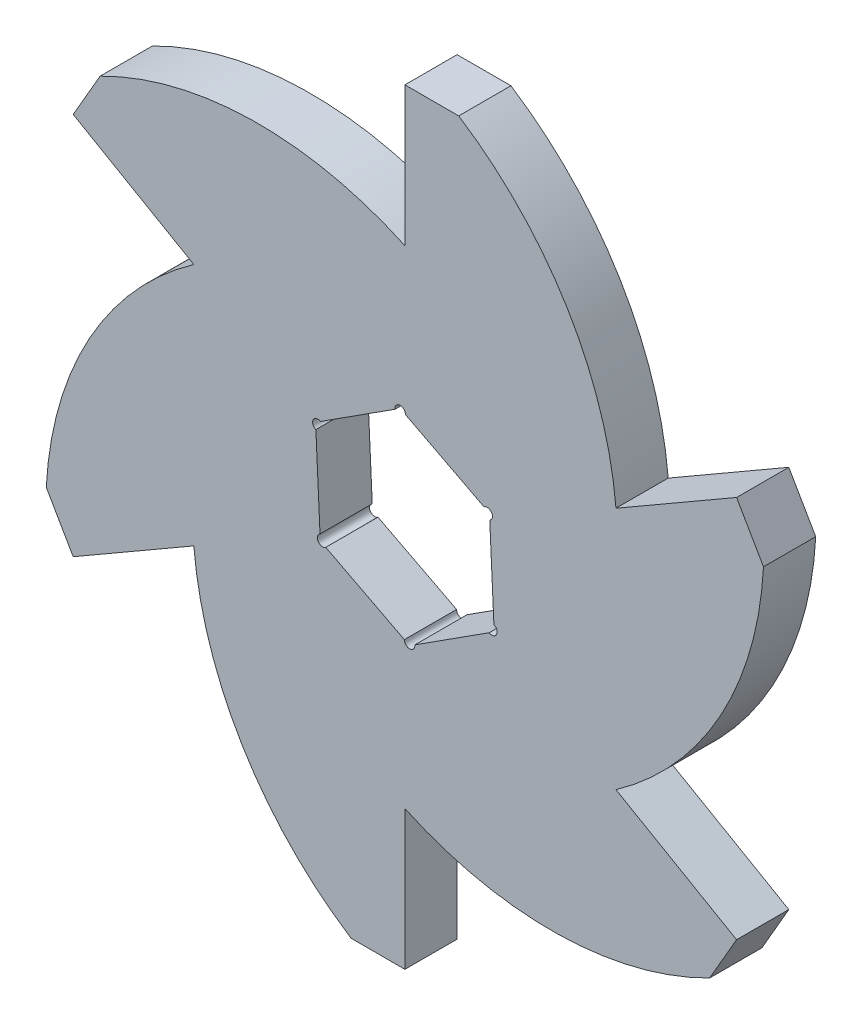
ISO-10303-21;
HEADER;
FILE_DESCRIPTION(('STEP AP214'),'2;1');
FILE_NAME('part.step','',(''),(''),'','','');
FILE_SCHEMA(('AUTOMOTIVE_DESIGN { 1 0 10303 214 1 1 1 1 }'));
ENDSEC;
DATA;
#1=APPLICATION_CONTEXT('core data for automotive mechanical design processes');
#2=APPLICATION_PROTOCOL_DEFINITION('international standard','automotive_design',2000,#1);
#3=PRODUCT_CONTEXT('',#1,'mechanical');
#4=PRODUCT('Part','Part','',(#3));
#5=PRODUCT_RELATED_PRODUCT_CATEGORY('part','',(#4));
#6=PRODUCT_DEFINITION_FORMATION('','',#4);
#7=PRODUCT_DEFINITION_CONTEXT('part definition',#1,'design');
#8=PRODUCT_DEFINITION('design','',#6,#7);
#9=PRODUCT_DEFINITION_SHAPE('','',#8);
#10=(LENGTH_UNIT() NAMED_UNIT(*) SI_UNIT(.MILLI.,.METRE.));
#11=(NAMED_UNIT(*) PLANE_ANGLE_UNIT() SI_UNIT($,.RADIAN.));
#12=(NAMED_UNIT(*) SI_UNIT($,.STERADIAN.) SOLID_ANGLE_UNIT());
#13=UNCERTAINTY_MEASURE_WITH_UNIT(LENGTH_MEASURE(1.E-05),#10,'distance_accuracy_value','');
#14=(GEOMETRIC_REPRESENTATION_CONTEXT(3) GLOBAL_UNCERTAINTY_ASSIGNED_CONTEXT((#13)) GLOBAL_UNIT_ASSIGNED_CONTEXT((#10,
#11,#12)) REPRESENTATION_CONTEXT('',''));
#15=CARTESIAN_POINT('',(0.,0.,0.));
#16=DIRECTION('',(0.,0.,1.));
#17=DIRECTION('',(1.,0.,0.));
#18=AXIS2_PLACEMENT_3D('',#15,#16,#17);
#19=CARTESIAN_POINT('',(-42.111348754247,-20.7007955097314,15.));
#20=DIRECTION('',(0.,0.,-1.));
#21=DIRECTION('',(-1.,0.,0.));
#22=AXIS2_PLACEMENT_3D('',#19,#20,#21);
#23=PLANE('',#22);
#24=CARTESIAN_POINT('',(-42.111348754247,-20.7007955097314,15.));
#25=DIRECTION('',(0.,0.,1.));
#26=DIRECTION('',(-1.,0.,0.));
#27=AXIS2_PLACEMENT_3D('',#24,#25,#26);
#28=CIRCLE('',#27,99.9999999999998);
#29=CARTESIAN_POINT('',(0.,70.,15.));
#30=VERTEX_POINT('',#29);
#31=CARTESIAN_POINT('',(-87.5330485076559,68.3883126433485,15.));
#32=VERTEX_POINT('',#31);
#33=EDGE_CURVE('E333',#30,#32,#28,.T.);
#34=ORIENTED_EDGE('',*,*,#33,.T.);
#35=DIRECTION('',(-0.500000000000011,-0.866025403784432,0.));
#36=VECTOR('',#35,1.);
#37=CARTESIAN_POINT('',(-95.2627944162876,55.0000000000011,15.));
#38=LINE('',#37,#36);
#39=CARTESIAN_POINT('',(-95.2627944162876,55.0000000000011,15.));
#40=VERTEX_POINT('',#39);
#41=EDGE_CURVE('E336',#32,#40,#38,.T.);
#42=ORIENTED_EDGE('',*,*,#41,.T.);
#43=DIRECTION('',(0.866025403784433,-0.50000000000001,0.));
#44=VECTOR('',#43,1.);
#45=CARTESIAN_POINT('',(-60.6217782649103,35.0000000000007,15.));
#46=LINE('',#45,#44);
#47=CARTESIAN_POINT('',(-60.6217782649103,35.0000000000007,15.));
#48=VERTEX_POINT('',#47);
#49=EDGE_CURVE('E339',#40,#48,#46,.T.);
#50=ORIENTED_EDGE('',*,*,#49,.T.);
#51=CARTESIAN_POINT('',(-3.12825958714913,-46.8198955636698,15.));
#52=DIRECTION('',(0.,0.,1.));
#53=DIRECTION('',(-1.,0.,0.));
#54=AXIS2_PLACEMENT_3D('',#51,#52,#53);
#55=CIRCLE('',#54,100.);
#56=CARTESIAN_POINT('',(-102.99254032492,-41.6116873566515,15.));
#57=VERTEX_POINT('',#56);
#58=EDGE_CURVE('E341',#48,#57,#55,.T.);
#59=ORIENTED_EDGE('',*,*,#58,.T.);
#60=DIRECTION('',(0.499999999999992,-0.866025403784443,0.));
#61=VECTOR('',#60,1.);
#62=CARTESIAN_POINT('',(-95.2627944162888,-54.9999999999991,15.));
#63=LINE('',#62,#61);
#64=CARTESIAN_POINT('',(-95.2627944162888,-54.9999999999991,15.));
#65=VERTEX_POINT('',#64);
#66=EDGE_CURVE('E343',#57,#65,#63,.T.);
#67=ORIENTED_EDGE('',*,*,#66,.T.);
#68=DIRECTION('',(0.866025403784443,0.499999999999992,0.));
#69=VECTOR('',#68,1.);
#70=CARTESIAN_POINT('',(-60.621778264911,-34.9999999999995,15.));
#71=LINE('',#70,#69);
#72=CARTESIAN_POINT('',(-60.621778264911,-34.9999999999995,15.));
#73=VERTEX_POINT('',#72);
#74=EDGE_CURVE('E345',#65,#73,#71,.T.);
#75=ORIENTED_EDGE('',*,*,#74,.T.);
#76=CARTESIAN_POINT('',(38.9830891670979,-26.1191000539382,15.));
#77=DIRECTION('',(0.,0.,1.));
#78=DIRECTION('',(-1.,0.,0.));
#79=AXIS2_PLACEMENT_3D('',#76,#77,#78);
#80=CIRCLE('',#79,100.);
#81=CARTESIAN_POINT('',(-15.4594918172639,-110.,15.));
#82=VERTEX_POINT('',#81);
#83=EDGE_CURVE('E347',#73,#82,#80,.T.);
#84=ORIENTED_EDGE('',*,*,#83,.T.);
#85=DIRECTION('',(1.,0.,0.));
#86=VECTOR('',#85,1.);
#87=CARTESIAN_POINT('',(-7.68125894545489E-13,-110.,15.));
#88=LINE('',#87,#86);
#89=CARTESIAN_POINT('',(-7.68125894545489E-13,-110.,15.));
#90=VERTEX_POINT('',#89);
#91=EDGE_CURVE('E349',#82,#90,#88,.T.);
#92=ORIENTED_EDGE('',*,*,#91,.T.);
#93=DIRECTION('',(0.,1.,0.));
#94=VECTOR('',#93,1.);
#95=CARTESIAN_POINT('',(-4.85722573273506E-13,-70.,15.));
#96=LINE('',#95,#94);
#97=CARTESIAN_POINT('',(-4.57966997657877E-13,-70.,15.));
#98=VERTEX_POINT('',#97);
#99=EDGE_CURVE('E351',#90,#98,#96,.T.);
#100=ORIENTED_EDGE('',*,*,#99,.T.);
#101=CARTESIAN_POINT('',(42.1113487542468,20.7007955097317,15.));
#102=DIRECTION('',(0.,0.,1.));
#103=DIRECTION('',(-1.,0.,0.));
#104=AXIS2_PLACEMENT_3D('',#101,#102,#103);
#105=CIRCLE('',#104,100.);
#106=CARTESIAN_POINT('',(87.5330485076564,-68.3883126433479,15.));
#107=VERTEX_POINT('',#106);
#108=EDGE_CURVE('E353',#98,#107,#105,.T.);
#109=ORIENTED_EDGE('',*,*,#108,.T.);
#110=DIRECTION('',(0.500000000000003,0.866025403784437,0.));
#111=VECTOR('',#110,1.);
#112=CARTESIAN_POINT('',(95.262794416288,-55.0000000000005,15.));
#113=LINE('',#112,#111);
#114=CARTESIAN_POINT('',(95.262794416288,-55.0000000000005,15.));
#115=VERTEX_POINT('',#114);
#116=EDGE_CURVE('E355',#107,#115,#113,.T.);
#117=ORIENTED_EDGE('',*,*,#116,.T.);
#118=DIRECTION('',(-0.866025403784436,0.500000000000004,0.));
#119=VECTOR('',#118,1.);
#120=CARTESIAN_POINT('',(60.6217782649106,-35.0000000000003,15.));
#121=LINE('',#120,#119);
#122=CARTESIAN_POINT('',(60.6217782649106,-35.0000000000002,15.));
#123=VERTEX_POINT('',#122);
#124=EDGE_CURVE('E357',#115,#123,#121,.T.);
#125=ORIENTED_EDGE('',*,*,#124,.T.);
#126=CARTESIAN_POINT('',(3.12825958714881,46.8198955636698,15.));
#127=DIRECTION('',(0.,0.,1.));
#128=DIRECTION('',(-1.,0.,0.));
#129=AXIS2_PLACEMENT_3D('',#126,#127,#128);
#130=CIRCLE('',#129,100.);
#131=CARTESIAN_POINT('',(102.99254032492,41.6116873566523,15.));
#132=VERTEX_POINT('',#131);
#133=EDGE_CURVE('E359',#123,#132,#130,.T.);
#134=ORIENTED_EDGE('',*,*,#133,.T.);
#135=DIRECTION('',(-0.499999999999998,0.86602540378444,0.));
#136=VECTOR('',#135,1.);
#137=CARTESIAN_POINT('',(95.2627944162884,54.9999999999998,15.));
#138=LINE('',#137,#136);
#139=CARTESIAN_POINT('',(95.2627944162884,54.9999999999998,15.));
#140=VERTEX_POINT('',#139);
#141=EDGE_CURVE('E361',#132,#140,#138,.T.);
#142=ORIENTED_EDGE('',*,*,#141,.T.);
#143=DIRECTION('',(-0.86602540378444,-0.499999999999998,0.));
#144=VECTOR('',#143,1.);
#145=CARTESIAN_POINT('',(60.6217782649108,34.9999999999999,15.));
#146=LINE('',#145,#144);
#147=CARTESIAN_POINT('',(60.6217782649108,34.9999999999999,15.));
#148=VERTEX_POINT('',#147);
#149=EDGE_CURVE('E363',#140,#148,#146,.T.);
#150=ORIENTED_EDGE('',*,*,#149,.T.);
#151=CARTESIAN_POINT('',(-38.983089167098,26.1191000539379,15.));
#152=DIRECTION('',(0.,0.,1.));
#153=DIRECTION('',(-1.,0.,0.));
#154=AXIS2_PLACEMENT_3D('',#151,#152,#153);
#155=CIRCLE('',#154,100.);
#156=CARTESIAN_POINT('',(15.4594918172631,110.,15.));
#157=VERTEX_POINT('',#156);
#158=EDGE_CURVE('E365',#148,#157,#155,.T.);
#159=ORIENTED_EDGE('',*,*,#158,.T.);
#160=DIRECTION('',(-1.,0.,0.));
#161=VECTOR('',#160,1.);
#162=CARTESIAN_POINT('',(0.,110.,15.));
#163=LINE('',#162,#161);
#164=CARTESIAN_POINT('',(0.,110.,15.));
#165=VERTEX_POINT('',#164);
#166=EDGE_CURVE('E367',#157,#165,#163,.T.);
#167=ORIENTED_EDGE('',*,*,#166,.T.);
#168=DIRECTION('',(0.,-1.,0.));
#169=VECTOR('',#168,1.);
#170=CARTESIAN_POINT('',(0.,70.,15.));
#171=LINE('',#170,#169);
#172=EDGE_CURVE('E369',#165,#30,#171,.T.);
#173=ORIENTED_EDGE('',*,*,#172,.T.);
#174=EDGE_LOOP('',(#34,#42,#50,#59,#67,#75,#84,#92,#100,#109,#117,#125,#134,#142,#150,#159,#167,#173));
#175=FACE_BOUND('',#174,.T.);
#176=CARTESIAN_POINT('',(23.6463426281882,15.2148825688252,15.));
#177=DIRECTION('',(0.,0.,1.));
#178=DIRECTION('',(1.,0.,0.));
#179=AXIS2_PLACEMENT_3D('',#176,#177,#178);
#180=CIRCLE('',#179,1.50000000000001);
#181=CARTESIAN_POINT('',(24.3749942249157,13.903750672109,15.));
#182=VERTEX_POINT('',#181);
#183=CARTESIAN_POINT('',(22.7269646283416,16.4001015753375,15.));
#184=VERTEX_POINT('',#183);
#185=EDGE_CURVE('E240',#182,#184,#180,.T.);
#186=ORIENTED_EDGE('',*,*,#185,.F.);
#187=DIRECTION('',(-0.04687980861272,0.998900537363173,0.));
#188=VECTOR('',#187,1.);
#189=CARTESIAN_POINT('',(25.5663869030583,-11.4820779313855,15.));
#190=LINE('',#189,#188);
#191=CARTESIAN_POINT('',(25.5663869030583,-11.4820779313855,15.));
#192=VERTEX_POINT('',#191);
#193=EDGE_CURVE('E281',#192,#182,#190,.T.);
#194=ORIENTED_EDGE('',*,*,#193,.F.);
#195=CARTESIAN_POINT('',(24.9996461342937,-12.8708921381894,15.));
#196=DIRECTION('',(0.,0.,1.));
#197=DIRECTION('',(1.,0.,0.));
#198=AXIS2_PLACEMENT_3D('',#195,#196,#197);
#199=CIRCLE('',#198,1.5);
#200=CARTESIAN_POINT('',(24.2284984023892,-14.1574888798215,15.));
#201=VERTEX_POINT('',#200);
#202=EDGE_CURVE('E279',#201,#192,#199,.T.);
#203=ORIENTED_EDGE('',*,*,#202,.F.);
#204=DIRECTION('',(0.841633336904074,0.540049373864754,0.));
#205=VECTOR('',#204,1.);
#206=CARTESIAN_POINT('',(2.83942227471654,-27.882179506723,15.));
#207=LINE('',#206,#205);
#208=CARTESIAN_POINT('',(2.83942227471654,-27.882179506723,15.));
#209=VERTEX_POINT('',#208);
#210=EDGE_CURVE('E277',#209,#201,#207,.T.);
#211=ORIENTED_EDGE('',*,*,#210,.F.);
#212=CARTESIAN_POINT('',(1.35330350610541,-28.0857747070145,15.));
#213=DIRECTION('',(0.,0.,1.));
#214=DIRECTION('',(1.,0.,0.));
#215=AXIS2_PLACEMENT_3D('',#212,#213,#214);
#216=CIRCLE('',#215,1.5);
#217=CARTESIAN_POINT('',(-0.146495822526594,-28.0612395519305,15.));
#218=VERTEX_POINT('',#217);
#219=EDGE_CURVE('E275',#218,#209,#216,.T.);
#220=ORIENTED_EDGE('',*,*,#219,.F.);
#221=DIRECTION('',(0.888513145516794,-0.458851163498418,0.));
#222=VECTOR('',#221,1.);
#223=CARTESIAN_POINT('',(-22.7269646283418,-16.4001015753374,15.));
#224=LINE('',#223,#222);
#225=CARTESIAN_POINT('',(-22.7269646283418,-16.4001015753374,15.));
#226=VERTEX_POINT('',#225);
#227=EDGE_CURVE('E273',#226,#218,#224,.T.);
#228=ORIENTED_EDGE('',*,*,#227,.F.);
#229=CARTESIAN_POINT('',(-23.6463426281883,-15.214882568825,15.));
#230=DIRECTION('',(0.,0.,1.));
#231=DIRECTION('',(1.,0.,0.));
#232=AXIS2_PLACEMENT_3D('',#229,#230,#231);
#233=CIRCLE('',#232,1.5);
#234=CARTESIAN_POINT('',(-24.3749942249157,-13.9037506721088,15.));
#235=VERTEX_POINT('',#234);
#236=EDGE_CURVE('E271',#235,#226,#233,.T.);
#237=ORIENTED_EDGE('',*,*,#236,.F.);
#238=DIRECTION('',(0.0468798086127201,-0.998900537363172,0.));
#239=VECTOR('',#238,1.);
#240=CARTESIAN_POINT('',(-25.5663869030583,11.4820779313857,15.));
#241=LINE('',#240,#239);
#242=CARTESIAN_POINT('',(-25.5663869030583,11.4820779313857,15.));
#243=VERTEX_POINT('',#242);
#244=EDGE_CURVE('E269',#243,#235,#241,.T.);
#245=ORIENTED_EDGE('',*,*,#244,.F.);
#246=CARTESIAN_POINT('',(-24.9996461342936,12.8708921381895,15.));
#247=DIRECTION('',(0.,0.,1.));
#248=DIRECTION('',(1.,0.,0.));
#249=AXIS2_PLACEMENT_3D('',#246,#247,#248);
#250=CIRCLE('',#249,1.5);
#251=CARTESIAN_POINT('',(-24.228498402389,14.1574888798216,15.));
#252=VERTEX_POINT('',#251);
#253=EDGE_CURVE('E267',#252,#243,#250,.T.);
#254=ORIENTED_EDGE('',*,*,#253,.F.);
#255=DIRECTION('',(-0.841633336904074,-0.540049373864755,0.));
#256=VECTOR('',#255,1.);
#257=CARTESIAN_POINT('',(-2.83942227471673,27.8821795067229,15.));
#258=LINE('',#257,#256);
#259=CARTESIAN_POINT('',(-2.83942227471673,27.8821795067229,15.));
#260=VERTEX_POINT('',#259);
#261=EDGE_CURVE('E263',#260,#252,#258,.T.);
#262=ORIENTED_EDGE('',*,*,#261,.F.);
#263=CARTESIAN_POINT('',(-1.3533035061056,28.0857747070145,15.));
#264=DIRECTION('',(0.,0.,1.));
#265=DIRECTION('',(1.,0.,0.));
#266=AXIS2_PLACEMENT_3D('',#263,#264,#265);
#267=CIRCLE('',#266,1.5);
#268=CARTESIAN_POINT('',(0.146495822526399,28.0612395519306,15.));
#269=VERTEX_POINT('',#268);
#270=EDGE_CURVE('E261',#269,#260,#267,.T.);
#271=ORIENTED_EDGE('',*,*,#270,.F.);
#272=DIRECTION('',(-0.888513145516794,0.458851163498418,0.));
#273=VECTOR('',#272,1.);
#274=CARTESIAN_POINT('',(22.7269646283416,16.4001015753375,15.));
#275=LINE('',#274,#273);
#276=EDGE_CURVE('E248',#184,#269,#275,.T.);
#277=ORIENTED_EDGE('',*,*,#276,.F.);
#278=EDGE_LOOP('',(#186,#194,#203,#211,#220,#228,#237,#245,#254,#262,#271,#277));
#279=FACE_BOUND('',#278,.T.);
#280=ADVANCED_FACE('F43',(#175,#279),#23,.F.);
#281=CARTESIAN_POINT('',(-42.111348754247,-20.7007955097314,0.));
#282=DIRECTION('',(0.,0.,-1.));
#283=DIRECTION('',(-1.,0.,0.));
#284=AXIS2_PLACEMENT_3D('',#281,#282,#283);
#285=PLANE('',#284);
#286=CARTESIAN_POINT('',(-42.111348754247,-20.7007955097314,0.));
#287=DIRECTION('',(0.,0.,1.));
#288=DIRECTION('',(-1.,0.,0.));
#289=AXIS2_PLACEMENT_3D('',#286,#287,#288);
#290=CIRCLE('',#289,99.9999999999998);
#291=CARTESIAN_POINT('',(0.,70.,0.));
#292=VERTEX_POINT('',#291);
#293=CARTESIAN_POINT('',(-87.5330485076559,68.3883126433485,0.));
#294=VERTEX_POINT('',#293);
#295=EDGE_CURVE('E256',#292,#294,#290,.T.);
#296=ORIENTED_EDGE('',*,*,#295,.F.);
#297=DIRECTION('',(0.,-1.,0.));
#298=VECTOR('',#297,1.);
#299=CARTESIAN_POINT('',(0.,70.,0.));
#300=LINE('',#299,#298);
#301=CARTESIAN_POINT('',(0.,110.,0.));
#302=VERTEX_POINT('',#301);
#303=EDGE_CURVE('E337',#302,#292,#300,.T.);
#304=ORIENTED_EDGE('',*,*,#303,.F.);
#305=DIRECTION('',(-1.,0.,0.));
#306=VECTOR('',#305,1.);
#307=CARTESIAN_POINT('',(0.,110.,0.));
#308=LINE('',#307,#306);
#309=CARTESIAN_POINT('',(15.4594918172631,110.,0.));
#310=VERTEX_POINT('',#309);
#311=EDGE_CURVE('E404',#310,#302,#308,.T.);
#312=ORIENTED_EDGE('',*,*,#311,.F.);
#313=CARTESIAN_POINT('',(-38.983089167098,26.1191000539379,0.));
#314=DIRECTION('',(0.,0.,1.));
#315=DIRECTION('',(-1.,0.,0.));
#316=AXIS2_PLACEMENT_3D('',#313,#314,#315);
#317=CIRCLE('',#316,100.);
#318=CARTESIAN_POINT('',(60.6217782649108,34.9999999999999,0.));
#319=VERTEX_POINT('',#318);
#320=EDGE_CURVE('E402',#319,#310,#317,.T.);
#321=ORIENTED_EDGE('',*,*,#320,.F.);
#322=DIRECTION('',(-0.86602540378444,-0.499999999999998,0.));
#323=VECTOR('',#322,1.);
#324=CARTESIAN_POINT('',(60.6217782649108,34.9999999999999,0.));
#325=LINE('',#324,#323);
#326=CARTESIAN_POINT('',(95.2627944162884,54.9999999999998,0.));
#327=VERTEX_POINT('',#326);
#328=EDGE_CURVE('E400',#327,#319,#325,.T.);
#329=ORIENTED_EDGE('',*,*,#328,.F.);
#330=DIRECTION('',(-0.499999999999998,0.86602540378444,0.));
#331=VECTOR('',#330,1.);
#332=CARTESIAN_POINT('',(95.2627944162884,54.9999999999998,0.));
#333=LINE('',#332,#331);
#334=CARTESIAN_POINT('',(102.99254032492,41.6116873566523,0.));
#335=VERTEX_POINT('',#334);
#336=EDGE_CURVE('E398',#335,#327,#333,.T.);
#337=ORIENTED_EDGE('',*,*,#336,.F.);
#338=CARTESIAN_POINT('',(3.12825958714881,46.8198955636698,0.));
#339=DIRECTION('',(0.,0.,1.));
#340=DIRECTION('',(-1.,0.,0.));
#341=AXIS2_PLACEMENT_3D('',#338,#339,#340);
#342=CIRCLE('',#341,100.);
#343=CARTESIAN_POINT('',(60.6217782649106,-35.0000000000002,0.));
#344=VERTEX_POINT('',#343);
#345=EDGE_CURVE('E396',#344,#335,#342,.T.);
#346=ORIENTED_EDGE('',*,*,#345,.F.);
#347=DIRECTION('',(-0.866025403784436,0.500000000000004,0.));
#348=VECTOR('',#347,1.);
#349=CARTESIAN_POINT('',(60.6217782649106,-35.0000000000003,0.));
#350=LINE('',#349,#348);
#351=CARTESIAN_POINT('',(95.262794416288,-55.0000000000005,0.));
#352=VERTEX_POINT('',#351);
#353=EDGE_CURVE('E394',#352,#344,#350,.T.);
#354=ORIENTED_EDGE('',*,*,#353,.F.);
#355=DIRECTION('',(0.500000000000003,0.866025403784437,0.));
#356=VECTOR('',#355,1.);
#357=CARTESIAN_POINT('',(95.262794416288,-55.0000000000005,0.));
#358=LINE('',#357,#356);
#359=CARTESIAN_POINT('',(87.5330485076564,-68.3883126433479,0.));
#360=VERTEX_POINT('',#359);
#361=EDGE_CURVE('E392',#360,#352,#358,.T.);
#362=ORIENTED_EDGE('',*,*,#361,.F.);
#363=CARTESIAN_POINT('',(42.1113487542468,20.7007955097317,0.));
#364=DIRECTION('',(0.,0.,1.));
#365=DIRECTION('',(-1.,0.,0.));
#366=AXIS2_PLACEMENT_3D('',#363,#364,#365);
#367=CIRCLE('',#366,100.);
#368=CARTESIAN_POINT('',(-4.57966997657877E-13,-70.,0.));
#369=VERTEX_POINT('',#368);
#370=EDGE_CURVE('E390',#369,#360,#367,.T.);
#371=ORIENTED_EDGE('',*,*,#370,.F.);
#372=DIRECTION('',(0.,1.,0.));
#373=VECTOR('',#372,1.);
#374=CARTESIAN_POINT('',(-4.85722573273506E-13,-70.,0.));
#375=LINE('',#374,#373);
#376=CARTESIAN_POINT('',(-7.68125894545489E-13,-110.,0.));
#377=VERTEX_POINT('',#376);
#378=EDGE_CURVE('E388',#377,#369,#375,.T.);
#379=ORIENTED_EDGE('',*,*,#378,.F.);
#380=DIRECTION('',(1.,0.,0.));
#381=VECTOR('',#380,1.);
#382=CARTESIAN_POINT('',(-7.68125894545489E-13,-110.,0.));
#383=LINE('',#382,#381);
#384=CARTESIAN_POINT('',(-15.4594918172639,-110.,0.));
#385=VERTEX_POINT('',#384);
#386=EDGE_CURVE('E386',#385,#377,#383,.T.);
#387=ORIENTED_EDGE('',*,*,#386,.F.);
#388=CARTESIAN_POINT('',(38.9830891670979,-26.1191000539382,0.));
#389=DIRECTION('',(0.,0.,1.));
#390=DIRECTION('',(-1.,0.,0.));
#391=AXIS2_PLACEMENT_3D('',#388,#389,#390);
#392=CIRCLE('',#391,100.);
#393=CARTESIAN_POINT('',(-60.621778264911,-34.9999999999995,0.));
#394=VERTEX_POINT('',#393);
#395=EDGE_CURVE('E384',#394,#385,#392,.T.);
#396=ORIENTED_EDGE('',*,*,#395,.F.);
#397=DIRECTION('',(0.866025403784443,0.499999999999992,0.));
#398=VECTOR('',#397,1.);
#399=CARTESIAN_POINT('',(-60.621778264911,-34.9999999999995,0.));
#400=LINE('',#399,#398);
#401=CARTESIAN_POINT('',(-95.2627944162888,-54.9999999999991,0.));
#402=VERTEX_POINT('',#401);
#403=EDGE_CURVE('E382',#402,#394,#400,.T.);
#404=ORIENTED_EDGE('',*,*,#403,.F.);
#405=DIRECTION('',(0.499999999999992,-0.866025403784443,0.));
#406=VECTOR('',#405,1.);
#407=CARTESIAN_POINT('',(-95.2627944162888,-54.9999999999991,0.));
#408=LINE('',#407,#406);
#409=CARTESIAN_POINT('',(-102.99254032492,-41.6116873566515,0.));
#410=VERTEX_POINT('',#409);
#411=EDGE_CURVE('E380',#410,#402,#408,.T.);
#412=ORIENTED_EDGE('',*,*,#411,.F.);
#413=CARTESIAN_POINT('',(-3.12825958714913,-46.8198955636698,0.));
#414=DIRECTION('',(0.,0.,1.));
#415=DIRECTION('',(-1.,0.,0.));
#416=AXIS2_PLACEMENT_3D('',#413,#414,#415);
#417=CIRCLE('',#416,100.);
#418=CARTESIAN_POINT('',(-60.6217782649103,35.0000000000007,0.));
#419=VERTEX_POINT('',#418);
#420=EDGE_CURVE('E378',#419,#410,#417,.T.);
#421=ORIENTED_EDGE('',*,*,#420,.F.);
#422=DIRECTION('',(0.866025403784433,-0.50000000000001,0.));
#423=VECTOR('',#422,1.);
#424=CARTESIAN_POINT('',(-60.6217782649103,35.0000000000007,0.));
#425=LINE('',#424,#423);
#426=CARTESIAN_POINT('',(-95.2627944162876,55.0000000000011,0.));
#427=VERTEX_POINT('',#426);
#428=EDGE_CURVE('E376',#427,#419,#425,.T.);
#429=ORIENTED_EDGE('',*,*,#428,.F.);
#430=DIRECTION('',(-0.500000000000011,-0.866025403784432,0.));
#431=VECTOR('',#430,1.);
#432=CARTESIAN_POINT('',(-95.2627944162876,55.0000000000011,0.));
#433=LINE('',#432,#431);
#434=EDGE_CURVE('E374',#294,#427,#433,.T.);
#435=ORIENTED_EDGE('',*,*,#434,.F.);
#436=EDGE_LOOP('',(#296,#304,#312,#321,#329,#337,#346,#354,#362,#371,#379,#387,#396,#404,#412,
#421,#429,#435));
#437=FACE_BOUND('',#436,.T.);
#438=DIRECTION('',(-0.04687980861272,0.998900537363173,0.));
#439=VECTOR('',#438,1.);
#440=CARTESIAN_POINT('',(25.5663869030583,-11.4820779313855,0.));
#441=LINE('',#440,#439);
#442=CARTESIAN_POINT('',(25.5663869030583,-11.4820779313855,0.));
#443=VERTEX_POINT('',#442);
#444=CARTESIAN_POINT('',(24.3749942249157,13.903750672109,0.));
#445=VERTEX_POINT('',#444);
#446=EDGE_CURVE('E249',#443,#445,#441,.T.);
#447=ORIENTED_EDGE('',*,*,#446,.T.);
#448=CARTESIAN_POINT('',(23.6463426281882,15.2148825688252,0.));
#449=DIRECTION('',(0.,0.,1.));
#450=DIRECTION('',(1.,0.,0.));
#451=AXIS2_PLACEMENT_3D('',#448,#449,#450);
#452=CIRCLE('',#451,1.50000000000001);
#453=CARTESIAN_POINT('',(22.7269646283416,16.4001015753375,0.));
#454=VERTEX_POINT('',#453);
#455=EDGE_CURVE('E66',#445,#454,#452,.T.);
#456=ORIENTED_EDGE('',*,*,#455,.T.);
#457=DIRECTION('',(-0.888513145516794,0.458851163498418,0.));
#458=VECTOR('',#457,1.);
#459=CARTESIAN_POINT('',(22.7269646283416,16.4001015753375,0.));
#460=LINE('',#459,#458);
#461=CARTESIAN_POINT('',(0.146495822526399,28.0612395519306,0.));
#462=VERTEX_POINT('',#461);
#463=EDGE_CURVE('E255',#454,#462,#460,.T.);
#464=ORIENTED_EDGE('',*,*,#463,.T.);
#465=CARTESIAN_POINT('',(-1.3533035061056,28.0857747070145,0.));
#466=DIRECTION('',(0.,0.,1.));
#467=DIRECTION('',(1.,0.,0.));
#468=AXIS2_PLACEMENT_3D('',#465,#466,#467);
#469=CIRCLE('',#468,1.5);
#470=CARTESIAN_POINT('',(-2.83942227471673,27.8821795067229,0.));
#471=VERTEX_POINT('',#470);
#472=EDGE_CURVE('E285',#462,#471,#469,.T.);
#473=ORIENTED_EDGE('',*,*,#472,.T.);
#474=DIRECTION('',(-0.841633336904074,-0.540049373864755,0.));
#475=VECTOR('',#474,1.);
#476=CARTESIAN_POINT('',(-2.83942227471673,27.8821795067229,0.));
#477=LINE('',#476,#475);
#478=CARTESIAN_POINT('',(-24.228498402389,14.1574888798216,0.));
#479=VERTEX_POINT('',#478);
#480=EDGE_CURVE('E288',#471,#479,#477,.T.);
#481=ORIENTED_EDGE('',*,*,#480,.T.);
#482=CARTESIAN_POINT('',(-24.9996461342936,12.8708921381895,0.));
#483=DIRECTION('',(0.,0.,1.));
#484=DIRECTION('',(1.,0.,0.));
#485=AXIS2_PLACEMENT_3D('',#482,#483,#484);
#486=CIRCLE('',#485,1.5);
#487=CARTESIAN_POINT('',(-25.5663869030583,11.4820779313857,0.));
#488=VERTEX_POINT('',#487);
#489=EDGE_CURVE('E291',#479,#488,#486,.T.);
#490=ORIENTED_EDGE('',*,*,#489,.T.);
#491=DIRECTION('',(0.0468798086127201,-0.998900537363172,0.));
#492=VECTOR('',#491,1.);
#493=CARTESIAN_POINT('',(-25.5663869030583,11.4820779313857,0.));
#494=LINE('',#493,#492);
#495=CARTESIAN_POINT('',(-24.3749942249157,-13.9037506721088,0.));
#496=VERTEX_POINT('',#495);
#497=EDGE_CURVE('E294',#488,#496,#494,.T.);
#498=ORIENTED_EDGE('',*,*,#497,.T.);
#499=CARTESIAN_POINT('',(-23.6463426281883,-15.214882568825,0.));
#500=DIRECTION('',(0.,0.,1.));
#501=DIRECTION('',(1.,0.,0.));
#502=AXIS2_PLACEMENT_3D('',#499,#500,#501);
#503=CIRCLE('',#502,1.5);
#504=CARTESIAN_POINT('',(-22.7269646283418,-16.4001015753374,0.));
#505=VERTEX_POINT('',#504);
#506=EDGE_CURVE('E297',#496,#505,#503,.T.);
#507=ORIENTED_EDGE('',*,*,#506,.T.);
#508=DIRECTION('',(0.888513145516794,-0.458851163498418,0.));
#509=VECTOR('',#508,1.);
#510=CARTESIAN_POINT('',(-22.7269646283418,-16.4001015753374,0.));
#511=LINE('',#510,#509);
#512=CARTESIAN_POINT('',(-0.146495822526594,-28.0612395519305,0.));
#513=VERTEX_POINT('',#512);
#514=EDGE_CURVE('E300',#505,#513,#511,.T.);
#515=ORIENTED_EDGE('',*,*,#514,.T.);
#516=CARTESIAN_POINT('',(1.35330350610541,-28.0857747070145,0.));
#517=DIRECTION('',(0.,0.,1.));
#518=DIRECTION('',(1.,0.,0.));
#519=AXIS2_PLACEMENT_3D('',#516,#517,#518);
#520=CIRCLE('',#519,1.5);
#521=CARTESIAN_POINT('',(2.83942227471654,-27.882179506723,0.));
#522=VERTEX_POINT('',#521);
#523=EDGE_CURVE('E303',#513,#522,#520,.T.);
#524=ORIENTED_EDGE('',*,*,#523,.T.);
#525=DIRECTION('',(0.841633336904074,0.540049373864754,0.));
#526=VECTOR('',#525,1.);
#527=CARTESIAN_POINT('',(2.83942227471654,-27.882179506723,0.));
#528=LINE('',#527,#526);
#529=CARTESIAN_POINT('',(24.2284984023892,-14.1574888798215,0.));
#530=VERTEX_POINT('',#529);
#531=EDGE_CURVE('E306',#522,#530,#528,.T.);
#532=ORIENTED_EDGE('',*,*,#531,.T.);
#533=CARTESIAN_POINT('',(24.9996461342937,-12.8708921381894,0.));
#534=DIRECTION('',(0.,0.,1.));
#535=DIRECTION('',(1.,0.,0.));
#536=AXIS2_PLACEMENT_3D('',#533,#534,#535);
#537=CIRCLE('',#536,1.5);
#538=EDGE_CURVE('E309',#530,#443,#537,.T.);
#539=ORIENTED_EDGE('',*,*,#538,.T.);
#540=EDGE_LOOP('',(#447,#456,#464,#473,#481,#490,#498,#507,#515,#524,#532,#539));
#541=FACE_BOUND('',#540,.T.);
#542=ADVANCED_FACE('F464',(#437,#541),#285,.T.);
#543=CARTESIAN_POINT('',(-42.111348754247,-20.7007955097314,15.));
#544=DIRECTION('',(0.,0.,-1.));
#545=DIRECTION('',(-1.,0.,0.));
#546=AXIS2_PLACEMENT_3D('',#543,#544,#545);
#547=CYLINDRICAL_SURFACE('',#546,99.9999999999998);
#548=ORIENTED_EDGE('',*,*,#295,.T.);
#549=DIRECTION('',(0.,0.,-1.));
#550=VECTOR('',#549,1.);
#551=CARTESIAN_POINT('',(-87.5330485076559,68.3883126433485,15.));
#552=LINE('',#551,#550);
#553=EDGE_CURVE('E11',#32,#294,#552,.T.);
#554=ORIENTED_EDGE('',*,*,#553,.F.);
#555=ORIENTED_EDGE('',*,*,#33,.F.);
#556=DIRECTION('',(0.,0.,-1.));
#557=VECTOR('',#556,1.);
#558=CARTESIAN_POINT('',(0.,70.,15.));
#559=LINE('',#558,#557);
#560=EDGE_CURVE('E371',#30,#292,#559,.T.);
#561=ORIENTED_EDGE('',*,*,#560,.T.);
#562=EDGE_LOOP('',(#548,#554,#555,#561));
#563=FACE_BOUND('',#562,.T.);
#564=ADVANCED_FACE('F45',(#563),#547,.T.);
#565=CARTESIAN_POINT('',(-95.2627944162876,55.0000000000011,15.));
#566=DIRECTION('',(0.866025403784432,-0.500000000000011,0.));
#567=DIRECTION('',(0.500000000000011,0.866025403784433,0.));
#568=AXIS2_PLACEMENT_3D('',#565,#566,#567);
#569=PLANE('',#568);
#570=ORIENTED_EDGE('',*,*,#434,.T.);
#571=DIRECTION('',(0.,0.,-1.));
#572=VECTOR('',#571,1.);
#573=CARTESIAN_POINT('',(-95.2627944162876,55.0000000000011,15.));
#574=LINE('',#573,#572);
#575=EDGE_CURVE('E51',#40,#427,#574,.T.);
#576=ORIENTED_EDGE('',*,*,#575,.F.);
#577=ORIENTED_EDGE('',*,*,#41,.F.);
#578=ORIENTED_EDGE('',*,*,#553,.T.);
#579=EDGE_LOOP('',(#570,#576,#577,#578));
#580=FACE_BOUND('',#579,.T.);
#581=ADVANCED_FACE('F481',(#580),#569,.F.);
#582=CARTESIAN_POINT('',(-60.6217782649103,35.0000000000007,15.));
#583=DIRECTION('',(0.50000000000001,0.866025403784433,0.));
#584=DIRECTION('',(-0.866025403784433,0.50000000000001,0.));
#585=AXIS2_PLACEMENT_3D('',#582,#583,#584);
#586=PLANE('',#585);
#587=ORIENTED_EDGE('',*,*,#428,.T.);
#588=DIRECTION('',(0.,0.,-1.));
#589=VECTOR('',#588,1.);
#590=CARTESIAN_POINT('',(-60.6217782649103,35.0000000000007,15.));
#591=LINE('',#590,#589);
#592=EDGE_CURVE('E451',#48,#419,#591,.T.);
#593=ORIENTED_EDGE('',*,*,#592,.F.);
#594=ORIENTED_EDGE('',*,*,#49,.F.);
#595=ORIENTED_EDGE('',*,*,#575,.T.);
#596=EDGE_LOOP('',(#587,#593,#594,#595));
#597=FACE_BOUND('',#596,.T.);
#598=ADVANCED_FACE('F458',(#597),#586,.F.);
#599=CARTESIAN_POINT('',(-3.12825958714913,-46.8198955636698,15.));
#600=DIRECTION('',(0.,0.,-1.));
#601=DIRECTION('',(-1.,0.,0.));
#602=AXIS2_PLACEMENT_3D('',#599,#600,#601);
#603=CYLINDRICAL_SURFACE('',#602,100.);
#604=ORIENTED_EDGE('',*,*,#420,.T.);
#605=DIRECTION('',(0.,0.,-1.));
#606=VECTOR('',#605,1.);
#607=CARTESIAN_POINT('',(-102.99254032492,-41.6116873566515,15.));
#608=LINE('',#607,#606);
#609=EDGE_CURVE('E448',#57,#410,#608,.T.);
#610=ORIENTED_EDGE('',*,*,#609,.F.);
#611=ORIENTED_EDGE('',*,*,#58,.F.);
#612=ORIENTED_EDGE('',*,*,#592,.T.);
#613=EDGE_LOOP('',(#604,#610,#611,#612));
#614=FACE_BOUND('',#613,.T.);
#615=ADVANCED_FACE('F470',(#614),#603,.T.);
#616=CARTESIAN_POINT('',(-95.2627944162888,-54.9999999999991,15.));
#617=DIRECTION('',(0.866025403784443,0.499999999999992,0.));
#618=DIRECTION('',(-0.499999999999992,0.866025403784443,0.));
#619=AXIS2_PLACEMENT_3D('',#616,#617,#618);
#620=PLANE('',#619);
#621=ORIENTED_EDGE('',*,*,#411,.T.);
#622=DIRECTION('',(0.,0.,-1.));
#623=VECTOR('',#622,1.);
#624=CARTESIAN_POINT('',(-95.2627944162888,-54.9999999999991,15.));
#625=LINE('',#624,#623);
#626=EDGE_CURVE('E445',#65,#402,#625,.T.);
#627=ORIENTED_EDGE('',*,*,#626,.F.);
#628=ORIENTED_EDGE('',*,*,#66,.F.);
#629=ORIENTED_EDGE('',*,*,#609,.T.);
#630=EDGE_LOOP('',(#621,#627,#628,#629));
#631=FACE_BOUND('',#630,.T.);
#632=ADVANCED_FACE('F474',(#631),#620,.F.);
#633=CARTESIAN_POINT('',(-60.621778264911,-34.9999999999995,15.));
#634=DIRECTION('',(-0.499999999999992,0.866025403784443,0.));
#635=DIRECTION('',(-0.866025403784443,-0.499999999999992,0.));
#636=AXIS2_PLACEMENT_3D('',#633,#634,#635);
#637=PLANE('',#636);
#638=ORIENTED_EDGE('',*,*,#403,.T.);
#639=DIRECTION('',(0.,0.,-1.));
#640=VECTOR('',#639,1.);
#641=CARTESIAN_POINT('',(-60.621778264911,-34.9999999999995,15.));
#642=LINE('',#641,#640);
#643=EDGE_CURVE('E442',#73,#394,#642,.T.);
#644=ORIENTED_EDGE('',*,*,#643,.F.);
#645=ORIENTED_EDGE('',*,*,#74,.F.);
#646=ORIENTED_EDGE('',*,*,#626,.T.);
#647=EDGE_LOOP('',(#638,#644,#645,#646));
#648=FACE_BOUND('',#647,.T.);
#649=ADVANCED_FACE('F544',(#648),#637,.F.);
#650=CARTESIAN_POINT('',(38.9830891670979,-26.1191000539382,15.));
#651=DIRECTION('',(0.,0.,-1.));
#652=DIRECTION('',(-1.,0.,0.));
#653=AXIS2_PLACEMENT_3D('',#650,#651,#652);
#654=CYLINDRICAL_SURFACE('',#653,100.);
#655=ORIENTED_EDGE('',*,*,#395,.T.);
#656=DIRECTION('',(0.,0.,-1.));
#657=VECTOR('',#656,1.);
#658=CARTESIAN_POINT('',(-15.4594918172639,-110.,15.));
#659=LINE('',#658,#657);
#660=EDGE_CURVE('E439',#82,#385,#659,.T.);
#661=ORIENTED_EDGE('',*,*,#660,.F.);
#662=ORIENTED_EDGE('',*,*,#83,.F.);
#663=ORIENTED_EDGE('',*,*,#643,.T.);
#664=EDGE_LOOP('',(#655,#661,#662,#663));
#665=FACE_BOUND('',#664,.T.);
#666=ADVANCED_FACE('F542',(#665),#654,.T.);
#667=CARTESIAN_POINT('',(-7.68125894545489E-13,-110.,15.));
#668=DIRECTION('',(0.,1.,0.));
#669=DIRECTION('',(-1.,0.,0.));
#670=AXIS2_PLACEMENT_3D('',#667,#668,#669);
#671=PLANE('',#670);
#672=ORIENTED_EDGE('',*,*,#386,.T.);
#673=DIRECTION('',(0.,0.,-1.));
#674=VECTOR('',#673,1.);
#675=CARTESIAN_POINT('',(-7.68125894545489E-13,-110.,15.));
#676=LINE('',#675,#674);
#677=EDGE_CURVE('E436',#90,#377,#676,.T.);
#678=ORIENTED_EDGE('',*,*,#677,.F.);
#679=ORIENTED_EDGE('',*,*,#91,.F.);
#680=ORIENTED_EDGE('',*,*,#660,.T.);
#681=EDGE_LOOP('',(#672,#678,#679,#680));
#682=FACE_BOUND('',#681,.T.);
#683=ADVANCED_FACE('F538',(#682),#671,.F.);
#684=CARTESIAN_POINT('',(-4.85722573273506E-13,-70.,15.));
#685=DIRECTION('',(-1.,0.,0.));
#686=DIRECTION('',(0.,-1.,0.));
#687=AXIS2_PLACEMENT_3D('',#684,#685,#686);
#688=PLANE('',#687);
#689=ORIENTED_EDGE('',*,*,#378,.T.);
#690=DIRECTION('',(0.,0.,-1.));
#691=VECTOR('',#690,1.);
#692=CARTESIAN_POINT('',(-4.57966997657877E-13,-70.,15.));
#693=LINE('',#692,#691);
#694=EDGE_CURVE('E433',#98,#369,#693,.T.);
#695=ORIENTED_EDGE('',*,*,#694,.F.);
#696=ORIENTED_EDGE('',*,*,#99,.F.);
#697=ORIENTED_EDGE('',*,*,#677,.T.);
#698=EDGE_LOOP('',(#689,#695,#696,#697));
#699=FACE_BOUND('',#698,.T.);
#700=ADVANCED_FACE('F533',(#699),#688,.F.);
#701=CARTESIAN_POINT('',(42.1113487542468,20.7007955097317,15.));
#702=DIRECTION('',(0.,0.,-1.));
#703=DIRECTION('',(-1.,0.,0.));
#704=AXIS2_PLACEMENT_3D('',#701,#702,#703);
#705=CYLINDRICAL_SURFACE('',#704,100.);
#706=ORIENTED_EDGE('',*,*,#370,.T.);
#707=DIRECTION('',(0.,0.,-1.));
#708=VECTOR('',#707,1.);
#709=CARTESIAN_POINT('',(87.5330485076564,-68.3883126433479,15.));
#710=LINE('',#709,#708);
#711=EDGE_CURVE('E430',#107,#360,#710,.T.);
#712=ORIENTED_EDGE('',*,*,#711,.F.);
#713=ORIENTED_EDGE('',*,*,#108,.F.);
#714=ORIENTED_EDGE('',*,*,#694,.T.);
#715=EDGE_LOOP('',(#706,#712,#713,#714));
#716=FACE_BOUND('',#715,.T.);
#717=ADVANCED_FACE('F527',(#716),#705,.T.);
#718=CARTESIAN_POINT('',(95.262794416288,-55.0000000000005,15.));
#719=DIRECTION('',(-0.866025403784437,0.500000000000003,0.));
#720=DIRECTION('',(-0.500000000000003,-0.866025403784437,0.));
#721=AXIS2_PLACEMENT_3D('',#718,#719,#720);
#722=PLANE('',#721);
#723=ORIENTED_EDGE('',*,*,#361,.T.);
#724=DIRECTION('',(0.,0.,-1.));
#725=VECTOR('',#724,1.);
#726=CARTESIAN_POINT('',(95.262794416288,-55.0000000000005,15.));
#727=LINE('',#726,#725);
#728=EDGE_CURVE('E427',#115,#352,#727,.T.);
#729=ORIENTED_EDGE('',*,*,#728,.F.);
#730=ORIENTED_EDGE('',*,*,#116,.F.);
#731=ORIENTED_EDGE('',*,*,#711,.T.);
#732=EDGE_LOOP('',(#723,#729,#730,#731));
#733=FACE_BOUND('',#732,.T.);
#734=ADVANCED_FACE('F523',(#733),#722,.F.);
#735=CARTESIAN_POINT('',(60.6217782649106,-35.0000000000003,15.));
#736=DIRECTION('',(-0.500000000000004,-0.866025403784436,0.));
#737=DIRECTION('',(0.866025403784436,-0.500000000000004,0.));
#738=AXIS2_PLACEMENT_3D('',#735,#736,#737);
#739=PLANE('',#738);
#740=ORIENTED_EDGE('',*,*,#353,.T.);
#741=DIRECTION('',(0.,0.,-1.));
#742=VECTOR('',#741,1.);
#743=CARTESIAN_POINT('',(60.6217782649106,-35.0000000000002,15.));
#744=LINE('',#743,#742);
#745=EDGE_CURVE('E424',#123,#344,#744,.T.);
#746=ORIENTED_EDGE('',*,*,#745,.F.);
#747=ORIENTED_EDGE('',*,*,#124,.F.);
#748=ORIENTED_EDGE('',*,*,#728,.T.);
#749=EDGE_LOOP('',(#740,#746,#747,#748));
#750=FACE_BOUND('',#749,.T.);
#751=ADVANCED_FACE('F518',(#750),#739,.F.);
#752=CARTESIAN_POINT('',(3.12825958714881,46.8198955636698,15.));
#753=DIRECTION('',(0.,0.,-1.));
#754=DIRECTION('',(-1.,0.,0.));
#755=AXIS2_PLACEMENT_3D('',#752,#753,#754);
#756=CYLINDRICAL_SURFACE('',#755,100.);
#757=ORIENTED_EDGE('',*,*,#345,.T.);
#758=DIRECTION('',(0.,0.,-1.));
#759=VECTOR('',#758,1.);
#760=CARTESIAN_POINT('',(102.99254032492,41.6116873566523,15.));
#761=LINE('',#760,#759);
#762=EDGE_CURVE('E421',#132,#335,#761,.T.);
#763=ORIENTED_EDGE('',*,*,#762,.F.);
#764=ORIENTED_EDGE('',*,*,#133,.F.);
#765=ORIENTED_EDGE('',*,*,#745,.T.);
#766=EDGE_LOOP('',(#757,#763,#764,#765));
#767=FACE_BOUND('',#766,.T.);
#768=ADVANCED_FACE('F512',(#767),#756,.T.);
#769=CARTESIAN_POINT('',(95.2627944162884,54.9999999999998,15.));
#770=DIRECTION('',(-0.86602540378444,-0.499999999999998,0.));
#771=DIRECTION('',(0.499999999999998,-0.86602540378444,0.));
#772=AXIS2_PLACEMENT_3D('',#769,#770,#771);
#773=PLANE('',#772);
#774=ORIENTED_EDGE('',*,*,#336,.T.);
#775=DIRECTION('',(0.,0.,-1.));
#776=VECTOR('',#775,1.);
#777=CARTESIAN_POINT('',(95.2627944162884,54.9999999999998,15.));
#778=LINE('',#777,#776);
#779=EDGE_CURVE('E418',#140,#327,#778,.T.);
#780=ORIENTED_EDGE('',*,*,#779,.F.);
#781=ORIENTED_EDGE('',*,*,#141,.F.);
#782=ORIENTED_EDGE('',*,*,#762,.T.);
#783=EDGE_LOOP('',(#774,#780,#781,#782));
#784=FACE_BOUND('',#783,.T.);
#785=ADVANCED_FACE('F508',(#784),#773,.F.);
#786=CARTESIAN_POINT('',(60.6217782649108,34.9999999999999,15.));
#787=DIRECTION('',(0.499999999999998,-0.86602540378444,0.));
#788=DIRECTION('',(0.86602540378444,0.499999999999998,0.));
#789=AXIS2_PLACEMENT_3D('',#786,#787,#788);
#790=PLANE('',#789);
#791=ORIENTED_EDGE('',*,*,#328,.T.);
#792=DIRECTION('',(0.,0.,-1.));
#793=VECTOR('',#792,1.);
#794=CARTESIAN_POINT('',(60.6217782649108,34.9999999999999,15.));
#795=LINE('',#794,#793);
#796=EDGE_CURVE('E415',#148,#319,#795,.T.);
#797=ORIENTED_EDGE('',*,*,#796,.F.);
#798=ORIENTED_EDGE('',*,*,#149,.F.);
#799=ORIENTED_EDGE('',*,*,#779,.T.);
#800=EDGE_LOOP('',(#791,#797,#798,#799));
#801=FACE_BOUND('',#800,.T.);
#802=ADVANCED_FACE('F503',(#801),#790,.F.);
#803=CARTESIAN_POINT('',(-38.983089167098,26.1191000539379,15.));
#804=DIRECTION('',(0.,0.,-1.));
#805=DIRECTION('',(-1.,0.,0.));
#806=AXIS2_PLACEMENT_3D('',#803,#804,#805);
#807=CYLINDRICAL_SURFACE('',#806,100.);
#808=ORIENTED_EDGE('',*,*,#320,.T.);
#809=DIRECTION('',(0.,0.,-1.));
#810=VECTOR('',#809,1.);
#811=CARTESIAN_POINT('',(15.4594918172631,110.,15.));
#812=LINE('',#811,#810);
#813=EDGE_CURVE('E412',#157,#310,#812,.T.);
#814=ORIENTED_EDGE('',*,*,#813,.F.);
#815=ORIENTED_EDGE('',*,*,#158,.F.);
#816=ORIENTED_EDGE('',*,*,#796,.T.);
#817=EDGE_LOOP('',(#808,#814,#815,#816));
#818=FACE_BOUND('',#817,.T.);
#819=ADVANCED_FACE('F497',(#818),#807,.T.);
#820=CARTESIAN_POINT('',(0.,110.,15.));
#821=DIRECTION('',(0.,-1.,0.));
#822=DIRECTION('',(0.,0.,-1.));
#823=AXIS2_PLACEMENT_3D('',#820,#821,#822);
#824=PLANE('',#823);
#825=ORIENTED_EDGE('',*,*,#311,.T.);
#826=DIRECTION('',(0.,0.,-1.));
#827=VECTOR('',#826,1.);
#828=CARTESIAN_POINT('',(0.,110.,15.));
#829=LINE('',#828,#827);
#830=EDGE_CURVE('E409',#165,#302,#829,.T.);
#831=ORIENTED_EDGE('',*,*,#830,.F.);
#832=ORIENTED_EDGE('',*,*,#166,.F.);
#833=ORIENTED_EDGE('',*,*,#813,.T.);
#834=EDGE_LOOP('',(#825,#831,#832,#833));
#835=FACE_BOUND('',#834,.T.);
#836=ADVANCED_FACE('F493',(#835),#824,.F.);
#837=CARTESIAN_POINT('',(0.,70.,15.));
#838=DIRECTION('',(1.,0.,0.));
#839=DIRECTION('',(0.,0.,-1.));
#840=AXIS2_PLACEMENT_3D('',#837,#838,#839);
#841=PLANE('',#840);
#842=ORIENTED_EDGE('',*,*,#303,.T.);
#843=ORIENTED_EDGE('',*,*,#560,.F.);
#844=ORIENTED_EDGE('',*,*,#172,.F.);
#845=ORIENTED_EDGE('',*,*,#830,.T.);
#846=EDGE_LOOP('',(#842,#843,#844,#845));
#847=FACE_BOUND('',#846,.T.);
#848=ADVANCED_FACE('F488',(#847),#841,.F.);
#849=CARTESIAN_POINT('',(23.6463426281882,15.2148825688252,15.));
#850=DIRECTION('',(0.,0.,-1.));
#851=DIRECTION('',(-1.,0.,0.));
#852=AXIS2_PLACEMENT_3D('',#849,#850,#851);
#853=CYLINDRICAL_SURFACE('',#852,1.50000000000001);
#854=ORIENTED_EDGE('',*,*,#455,.F.);
#855=DIRECTION('',(0.,0.,-1.));
#856=VECTOR('',#855,1.);
#857=CARTESIAN_POINT('',(24.3749942249157,13.903750672109,15.));
#858=LINE('',#857,#856);
#859=EDGE_CURVE('E244',#182,#445,#858,.T.);
#860=ORIENTED_EDGE('',*,*,#859,.F.);
#861=ORIENTED_EDGE('',*,*,#185,.T.);
#862=DIRECTION('',(0.,0.,-1.));
#863=VECTOR('',#862,1.);
#864=CARTESIAN_POINT('',(22.7269646283416,16.4001015753375,15.));
#865=LINE('',#864,#863);
#866=EDGE_CURVE('E243',#184,#454,#865,.T.);
#867=ORIENTED_EDGE('',*,*,#866,.T.);
#868=EDGE_LOOP('',(#854,#860,#861,#867));
#869=FACE_BOUND('',#868,.T.);
#870=ADVANCED_FACE('F242',(#869),#853,.F.);
#871=CARTESIAN_POINT('',(22.7269646283416,16.4001015753375,15.));
#872=DIRECTION('',(-0.458851163498418,-0.888513145516794,0.));
#873=DIRECTION('',(0.888513145516794,-0.458851163498418,0.));
#874=AXIS2_PLACEMENT_3D('',#871,#872,#873);
#875=PLANE('',#874);
#876=ORIENTED_EDGE('',*,*,#463,.F.);
#877=ORIENTED_EDGE('',*,*,#866,.F.);
#878=ORIENTED_EDGE('',*,*,#276,.T.);
#879=DIRECTION('',(0.,0.,-1.));
#880=VECTOR('',#879,1.);
#881=CARTESIAN_POINT('',(0.146495822526399,28.0612395519306,15.));
#882=LINE('',#881,#880);
#883=EDGE_CURVE('E257',#269,#462,#882,.T.);
#884=ORIENTED_EDGE('',*,*,#883,.T.);
#885=EDGE_LOOP('',(#876,#877,#878,#884));
#886=FACE_BOUND('',#885,.T.);
#887=ADVANCED_FACE('F252',(#886),#875,.T.);
#888=CARTESIAN_POINT('',(-1.3533035061056,28.0857747070145,15.));
#889=DIRECTION('',(0.,0.,-1.));
#890=DIRECTION('',(-1.,0.,0.));
#891=AXIS2_PLACEMENT_3D('',#888,#889,#890);
#892=CYLINDRICAL_SURFACE('',#891,1.5);
#893=ORIENTED_EDGE('',*,*,#472,.F.);
#894=ORIENTED_EDGE('',*,*,#883,.F.);
#895=ORIENTED_EDGE('',*,*,#270,.T.);
#896=DIRECTION('',(0.,0.,-1.));
#897=VECTOR('',#896,1.);
#898=CARTESIAN_POINT('',(-2.83942227471673,27.8821795067229,15.));
#899=LINE('',#898,#897);
#900=EDGE_CURVE('E330',#260,#471,#899,.T.);
#901=ORIENTED_EDGE('',*,*,#900,.T.);
#902=EDGE_LOOP('',(#893,#894,#895,#901));
#903=FACE_BOUND('',#902,.T.);
#904=ADVANCED_FACE('F650',(#903),#892,.F.);
#905=CARTESIAN_POINT('',(-2.83942227471673,27.8821795067229,15.));
#906=DIRECTION('',(0.540049373864755,-0.841633336904074,0.));
#907=DIRECTION('',(0.841633336904074,0.540049373864755,0.));
#908=AXIS2_PLACEMENT_3D('',#905,#906,#907);
#909=PLANE('',#908);
#910=ORIENTED_EDGE('',*,*,#480,.F.);
#911=ORIENTED_EDGE('',*,*,#900,.F.);
#912=ORIENTED_EDGE('',*,*,#261,.T.);
#913=DIRECTION('',(0.,0.,-1.));
#914=VECTOR('',#913,1.);
#915=CARTESIAN_POINT('',(-24.228498402389,14.1574888798216,15.));
#916=LINE('',#915,#914);
#917=EDGE_CURVE('E328',#252,#479,#916,.T.);
#918=ORIENTED_EDGE('',*,*,#917,.T.);
#919=EDGE_LOOP('',(#910,#911,#912,#918));
#920=FACE_BOUND('',#919,.T.);
#921=ADVANCED_FACE('F657',(#920),#909,.T.);
#922=CARTESIAN_POINT('',(-24.9996461342936,12.8708921381895,15.));
#923=DIRECTION('',(0.,0.,-1.));
#924=DIRECTION('',(-1.,0.,0.));
#925=AXIS2_PLACEMENT_3D('',#922,#923,#924);
#926=CYLINDRICAL_SURFACE('',#925,1.5);
#927=ORIENTED_EDGE('',*,*,#489,.F.);
#928=ORIENTED_EDGE('',*,*,#917,.F.);
#929=ORIENTED_EDGE('',*,*,#253,.T.);
#930=DIRECTION('',(0.,0.,-1.));
#931=VECTOR('',#930,1.);
#932=CARTESIAN_POINT('',(-25.5663869030583,11.4820779313857,15.));
#933=LINE('',#932,#931);
#934=EDGE_CURVE('E326',#243,#488,#933,.T.);
#935=ORIENTED_EDGE('',*,*,#934,.T.);
#936=EDGE_LOOP('',(#927,#928,#929,#935));
#937=FACE_BOUND('',#936,.T.);
#938=ADVANCED_FACE('F666',(#937),#926,.F.);
#939=CARTESIAN_POINT('',(-25.5663869030583,11.4820779313857,15.));
#940=DIRECTION('',(0.998900537363172,0.0468798086127201,0.));
#941=DIRECTION('',(-0.0468798086127201,0.998900537363173,0.));
#942=AXIS2_PLACEMENT_3D('',#939,#940,#941);
#943=PLANE('',#942);
#944=ORIENTED_EDGE('',*,*,#497,.F.);
#945=ORIENTED_EDGE('',*,*,#934,.F.);
#946=ORIENTED_EDGE('',*,*,#244,.T.);
#947=DIRECTION('',(0.,0.,-1.));
#948=VECTOR('',#947,1.);
#949=CARTESIAN_POINT('',(-24.3749942249157,-13.9037506721088,15.));
#950=LINE('',#949,#948);
#951=EDGE_CURVE('E324',#235,#496,#950,.T.);
#952=ORIENTED_EDGE('',*,*,#951,.T.);
#953=EDGE_LOOP('',(#944,#945,#946,#952));
#954=FACE_BOUND('',#953,.T.);
#955=ADVANCED_FACE('F675',(#954),#943,.T.);
#956=CARTESIAN_POINT('',(-23.6463426281883,-15.214882568825,15.));
#957=DIRECTION('',(0.,0.,-1.));
#958=DIRECTION('',(-1.,0.,0.));
#959=AXIS2_PLACEMENT_3D('',#956,#957,#958);
#960=CYLINDRICAL_SURFACE('',#959,1.5);
#961=ORIENTED_EDGE('',*,*,#506,.F.);
#962=ORIENTED_EDGE('',*,*,#951,.F.);
#963=ORIENTED_EDGE('',*,*,#236,.T.);
#964=DIRECTION('',(0.,0.,-1.));
#965=VECTOR('',#964,1.);
#966=CARTESIAN_POINT('',(-22.7269646283418,-16.4001015753374,15.));
#967=LINE('',#966,#965);
#968=EDGE_CURVE('E322',#226,#505,#967,.T.);
#969=ORIENTED_EDGE('',*,*,#968,.T.);
#970=EDGE_LOOP('',(#961,#962,#963,#969));
#971=FACE_BOUND('',#970,.T.);
#972=ADVANCED_FACE('F684',(#971),#960,.F.);
#973=CARTESIAN_POINT('',(-22.7269646283418,-16.4001015753374,15.));
#974=DIRECTION('',(0.458851163498418,0.888513145516794,0.));
#975=DIRECTION('',(-0.888513145516794,0.458851163498418,0.));
#976=AXIS2_PLACEMENT_3D('',#973,#974,#975);
#977=PLANE('',#976);
#978=ORIENTED_EDGE('',*,*,#514,.F.);
#979=ORIENTED_EDGE('',*,*,#968,.F.);
#980=ORIENTED_EDGE('',*,*,#227,.T.);
#981=DIRECTION('',(0.,0.,-1.));
#982=VECTOR('',#981,1.);
#983=CARTESIAN_POINT('',(-0.146495822526594,-28.0612395519305,15.));
#984=LINE('',#983,#982);
#985=EDGE_CURVE('E320',#218,#513,#984,.T.);
#986=ORIENTED_EDGE('',*,*,#985,.T.);
#987=EDGE_LOOP('',(#978,#979,#980,#986));
#988=FACE_BOUND('',#987,.T.);
#989=ADVANCED_FACE('F693',(#988),#977,.T.);
#990=CARTESIAN_POINT('',(1.35330350610541,-28.0857747070145,15.));
#991=DIRECTION('',(0.,0.,-1.));
#992=DIRECTION('',(-1.,0.,0.));
#993=AXIS2_PLACEMENT_3D('',#990,#991,#992);
#994=CYLINDRICAL_SURFACE('',#993,1.5);
#995=ORIENTED_EDGE('',*,*,#523,.F.);
#996=ORIENTED_EDGE('',*,*,#985,.F.);
#997=ORIENTED_EDGE('',*,*,#219,.T.);
#998=DIRECTION('',(0.,0.,-1.));
#999=VECTOR('',#998,1.);
#1000=CARTESIAN_POINT('',(2.83942227471654,-27.882179506723,15.));
#1001=LINE('',#1000,#999);
#1002=EDGE_CURVE('E318',#209,#522,#1001,.T.);
#1003=ORIENTED_EDGE('',*,*,#1002,.T.);
#1004=EDGE_LOOP('',(#995,#996,#997,#1003));
#1005=FACE_BOUND('',#1004,.T.);
#1006=ADVANCED_FACE('F702',(#1005),#994,.F.);
#1007=CARTESIAN_POINT('',(2.83942227471654,-27.882179506723,15.));
#1008=DIRECTION('',(-0.540049373864754,0.841633336904074,0.));
#1009=DIRECTION('',(-0.841633336904074,-0.540049373864754,0.));
#1010=AXIS2_PLACEMENT_3D('',#1007,#1008,#1009);
#1011=PLANE('',#1010);
#1012=ORIENTED_EDGE('',*,*,#531,.F.);
#1013=ORIENTED_EDGE('',*,*,#1002,.F.);
#1014=ORIENTED_EDGE('',*,*,#210,.T.);
#1015=DIRECTION('',(0.,0.,-1.));
#1016=VECTOR('',#1015,1.);
#1017=CARTESIAN_POINT('',(24.2284984023892,-14.1574888798215,15.));
#1018=LINE('',#1017,#1016);
#1019=EDGE_CURVE('E316',#201,#530,#1018,.T.);
#1020=ORIENTED_EDGE('',*,*,#1019,.T.);
#1021=EDGE_LOOP('',(#1012,#1013,#1014,#1020));
#1022=FACE_BOUND('',#1021,.T.);
#1023=ADVANCED_FACE('F711',(#1022),#1011,.T.);
#1024=CARTESIAN_POINT('',(24.9996461342937,-12.8708921381894,15.));
#1025=DIRECTION('',(0.,0.,-1.));
#1026=DIRECTION('',(-1.,0.,0.));
#1027=AXIS2_PLACEMENT_3D('',#1024,#1025,#1026);
#1028=CYLINDRICAL_SURFACE('',#1027,1.5);
#1029=ORIENTED_EDGE('',*,*,#538,.F.);
#1030=ORIENTED_EDGE('',*,*,#1019,.F.);
#1031=ORIENTED_EDGE('',*,*,#202,.T.);
#1032=DIRECTION('',(0.,0.,-1.));
#1033=VECTOR('',#1032,1.);
#1034=CARTESIAN_POINT('',(25.5663869030583,-11.4820779313855,15.));
#1035=LINE('',#1034,#1033);
#1036=EDGE_CURVE('E58',#192,#443,#1035,.T.);
#1037=ORIENTED_EDGE('',*,*,#1036,.T.);
#1038=EDGE_LOOP('',(#1029,#1030,#1031,#1037));
#1039=FACE_BOUND('',#1038,.T.);
#1040=ADVANCED_FACE('F720',(#1039),#1028,.F.);
#1041=CARTESIAN_POINT('',(25.5663869030583,-11.4820779313855,15.));
#1042=DIRECTION('',(-0.998900537363172,-0.04687980861272,0.));
#1043=DIRECTION('',(0.04687980861272,-0.998900537363173,0.));
#1044=AXIS2_PLACEMENT_3D('',#1041,#1042,#1043);
#1045=PLANE('',#1044);
#1046=ORIENTED_EDGE('',*,*,#446,.F.);
#1047=ORIENTED_EDGE('',*,*,#1036,.F.);
#1048=ORIENTED_EDGE('',*,*,#193,.T.);
#1049=ORIENTED_EDGE('',*,*,#859,.T.);
#1050=EDGE_LOOP('',(#1046,#1047,#1048,#1049));
#1051=FACE_BOUND('',#1050,.T.);
#1052=ADVANCED_FACE('F729',(#1051),#1045,.T.);
#1053=CLOSED_SHELL('',(#280,#542,#564,#581,#598,#615,#632,#649,#666,#683,#700,#717,#734,#751,
#768,#785,#802,#819,#836,#848,#870,#887,#904,#921,#938,#955,#972,#989,#1006,#1023,#1040,#1052));
#1054=MANIFOLD_SOLID_BREP('B2',#1053);
#1055=ADVANCED_BREP_SHAPE_REPRESENTATION('',(#18,#1054),#14);
#1056=SHAPE_DEFINITION_REPRESENTATION(#9,#1055);
ENDSEC;
END-ISO-10303-21;
